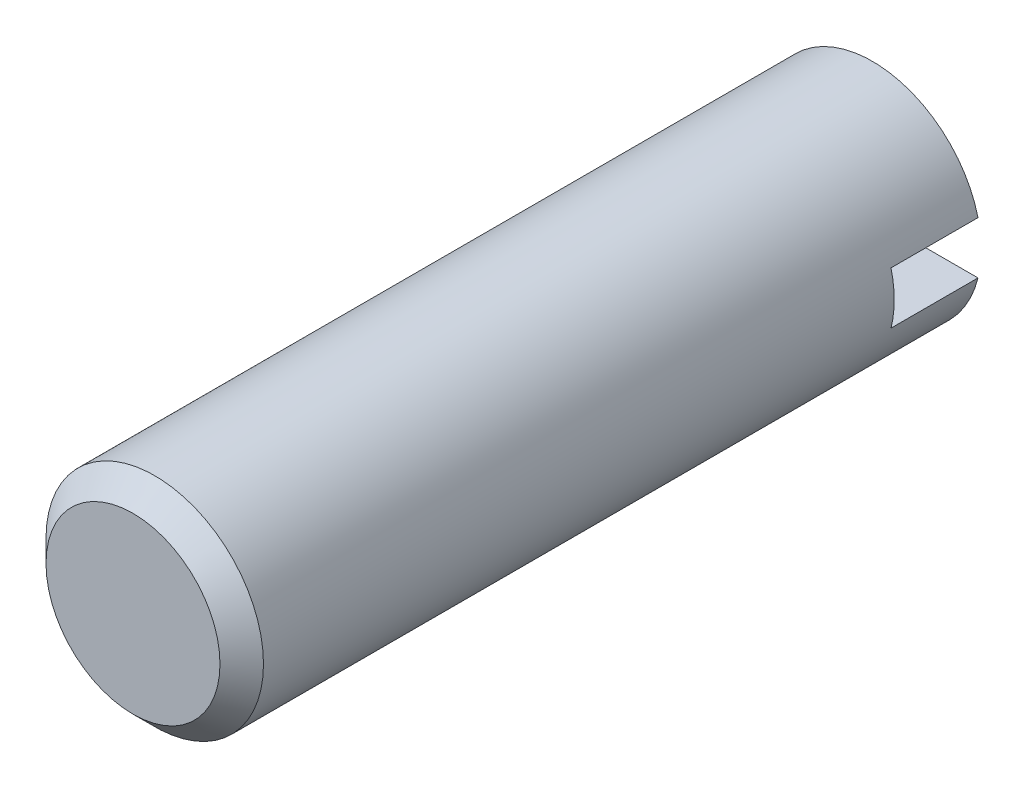
ISO-10303-21;
HEADER;
FILE_DESCRIPTION(('STEP AP214'),'2;1');
FILE_NAME('part.step','',(''),(''),'','','');
FILE_SCHEMA(('AUTOMOTIVE_DESIGN { 1 0 10303 214 1 1 1 1 }'));
ENDSEC;
DATA;
#1=APPLICATION_CONTEXT('core data for automotive mechanical design processes');
#2=APPLICATION_PROTOCOL_DEFINITION('international standard','automotive_design',2000,#1);
#3=PRODUCT_CONTEXT('',#1,'mechanical');
#4=PRODUCT('Part','Part','',(#3));
#5=PRODUCT_RELATED_PRODUCT_CATEGORY('part','',(#4));
#6=PRODUCT_DEFINITION_FORMATION('','',#4);
#7=PRODUCT_DEFINITION_CONTEXT('part definition',#1,'design');
#8=PRODUCT_DEFINITION('design','',#6,#7);
#9=PRODUCT_DEFINITION_SHAPE('','',#8);
#10=(LENGTH_UNIT() NAMED_UNIT(*) SI_UNIT(.MILLI.,.METRE.));
#11=(NAMED_UNIT(*) PLANE_ANGLE_UNIT() SI_UNIT($,.RADIAN.));
#12=(NAMED_UNIT(*) SI_UNIT($,.STERADIAN.) SOLID_ANGLE_UNIT());
#13=UNCERTAINTY_MEASURE_WITH_UNIT(LENGTH_MEASURE(1.E-05),#10,'distance_accuracy_value','');
#14=(GEOMETRIC_REPRESENTATION_CONTEXT(3) GLOBAL_UNCERTAINTY_ASSIGNED_CONTEXT((#13)) GLOBAL_UNIT_ASSIGNED_CONTEXT((#10,
#11,#12)) REPRESENTATION_CONTEXT('',''));
#15=CARTESIAN_POINT('',(0.,0.,0.));
#16=DIRECTION('',(0.,0.,1.));
#17=DIRECTION('',(1.,0.,0.));
#18=AXIS2_PLACEMENT_3D('',#15,#16,#17);
#19=CARTESIAN_POINT('',(0.,2.5,-17.));
#20=DIRECTION('',(0.,0.,1.));
#21=DIRECTION('',(1.,0.,0.));
#22=AXIS2_PLACEMENT_3D('',#19,#20,#21);
#23=PLANE('',#22);
#24=CARTESIAN_POINT('',(0.,0.,-17.));
#25=DIRECTION('',(0.,0.,1.));
#26=DIRECTION('',(1.,0.,0.));
#27=AXIS2_PLACEMENT_3D('',#24,#25,#26);
#28=CIRCLE('',#27,2.5);
#29=CARTESIAN_POINT('',(2.42693221990237,0.600000000000003,-17.));
#30=VERTEX_POINT('',#29);
#31=CARTESIAN_POINT('',(-2.42693221990226,0.600000000000059,-17.));
#32=VERTEX_POINT('',#31);
#33=EDGE_CURVE('E103',#30,#32,#28,.T.);
#34=ORIENTED_EDGE('',*,*,#33,.F.);
#35=DIRECTION('',(-1.,0.,0.));
#36=VECTOR('',#35,1.);
#37=CARTESIAN_POINT('',(1.11022302462516E-13,0.600000000000031,-17.));
#38=LINE('',#37,#36);
#39=EDGE_CURVE('E90',#30,#32,#38,.T.);
#40=ORIENTED_EDGE('',*,*,#39,.T.);
#41=EDGE_LOOP('',(#34,#40));
#42=FACE_BOUND('',#41,.T.);
#43=ADVANCED_FACE('F43',(#42),#23,.F.);
#44=CARTESIAN_POINT('',(0.,0.,0.));
#45=DIRECTION('',(0.,0.,-1.));
#46=DIRECTION('',(-1.,0.,0.));
#47=AXIS2_PLACEMENT_3D('',#44,#45,#46);
#48=PLANE('',#47);
#49=CARTESIAN_POINT('',(0.,0.,0.));
#50=DIRECTION('',(0.,0.,1.));
#51=DIRECTION('',(1.,0.,0.));
#52=AXIS2_PLACEMENT_3D('',#49,#50,#51);
#53=CIRCLE('',#52,2.);
#54=CARTESIAN_POINT('',(2.,0.,0.));
#55=VERTEX_POINT('',#54);
#56=EDGE_CURVE('E91',#55,#55,#53,.T.);
#57=ORIENTED_EDGE('',*,*,#56,.T.);
#58=EDGE_LOOP('',(#57));
#59=FACE_BOUND('',#58,.T.);
#60=ADVANCED_FACE('F45',(#59),#48,.F.);
#61=CARTESIAN_POINT('',(0.,0.,-0.5));
#62=DIRECTION('',(0.,0.,-1.));
#63=DIRECTION('',(-1.,0.,0.));
#64=AXIS2_PLACEMENT_3D('',#61,#62,#63);
#65=CONICAL_SURFACE('',#64,2.5,0.78539816339745);
#66=ORIENTED_EDGE('',*,*,#56,.F.);
#67=EDGE_LOOP('',(#66));
#68=FACE_BOUND('',#67,.T.);
#69=CARTESIAN_POINT('',(0.,0.,-0.5));
#70=DIRECTION('',(0.,0.,1.));
#71=DIRECTION('',(1.,0.,0.));
#72=AXIS2_PLACEMENT_3D('',#69,#70,#71);
#73=CIRCLE('',#72,2.5);
#74=CARTESIAN_POINT('',(2.50000000000001,0.,-0.5));
#75=VERTEX_POINT('',#74);
#76=EDGE_CURVE('E107',#75,#75,#73,.T.);
#77=ORIENTED_EDGE('',*,*,#76,.T.);
#78=EDGE_LOOP('',(#77));
#79=FACE_BOUND('',#78,.T.);
#80=ADVANCED_FACE('F129',(#68,#79),#65,.T.);
#81=CARTESIAN_POINT('',(0.,0.,0.));
#82=DIRECTION('',(0.,0.,1.));
#83=DIRECTION('',(1.,0.,0.));
#84=AXIS2_PLACEMENT_3D('',#81,#82,#83);
#85=CYLINDRICAL_SURFACE('',#84,2.5);
#86=CARTESIAN_POINT('',(0.,0.,-15.));
#87=DIRECTION('',(0.,0.,-1.));
#88=DIRECTION('',(-1.,0.,0.));
#89=AXIS2_PLACEMENT_3D('',#86,#87,#88);
#90=CIRCLE('',#89,2.5);
#91=CARTESIAN_POINT('',(2.42693221990237,0.600000000000003,-15.));
#92=VERTEX_POINT('',#91);
#93=CARTESIAN_POINT('',(2.42693221990239,-0.600000000000003,-15.));
#94=VERTEX_POINT('',#93);
#95=EDGE_CURVE('E11',#92,#94,#90,.T.);
#96=ORIENTED_EDGE('',*,*,#95,.F.);
#97=DIRECTION('',(0.,0.,1.));
#98=VECTOR('',#97,1.);
#99=CARTESIAN_POINT('',(2.42693221990237,0.600000000000003,0.));
#100=LINE('',#99,#98);
#101=EDGE_CURVE('E66',#92,#30,#100,.F.);
#102=ORIENTED_EDGE('',*,*,#101,.T.);
#103=ORIENTED_EDGE('',*,*,#33,.T.);
#104=DIRECTION('',(0.,0.,1.));
#105=VECTOR('',#104,1.);
#106=CARTESIAN_POINT('',(-2.42693221990226,0.600000000000059,0.));
#107=LINE('',#106,#105);
#108=CARTESIAN_POINT('',(-2.42693221990226,0.600000000000059,-15.));
#109=VERTEX_POINT('',#108);
#110=EDGE_CURVE('E104',#32,#109,#107,.T.);
#111=ORIENTED_EDGE('',*,*,#110,.T.);
#112=CARTESIAN_POINT('',(-2.42693221990228,-0.599999999999989,-15.));
#113=VERTEX_POINT('',#112);
#114=EDGE_CURVE('E47',#113,#109,#90,.T.);
#115=ORIENTED_EDGE('',*,*,#114,.F.);
#116=DIRECTION('',(0.,0.,1.));
#117=VECTOR('',#116,1.);
#118=CARTESIAN_POINT('',(-2.42693221990228,-0.599999999999989,0.));
#119=LINE('',#118,#117);
#120=CARTESIAN_POINT('',(-2.42693221990228,-0.599999999999989,-17.));
#121=VERTEX_POINT('',#120);
#122=EDGE_CURVE('E85',#113,#121,#119,.F.);
#123=ORIENTED_EDGE('',*,*,#122,.T.);
#124=CARTESIAN_POINT('',(2.42693221990239,-0.600000000000003,-17.));
#125=VERTEX_POINT('',#124);
#126=EDGE_CURVE('E98',#121,#125,#28,.T.);
#127=ORIENTED_EDGE('',*,*,#126,.T.);
#128=DIRECTION('',(0.,0.,1.));
#129=VECTOR('',#128,1.);
#130=CARTESIAN_POINT('',(2.42693221990239,-0.600000000000003,0.));
#131=LINE('',#130,#129);
#132=EDGE_CURVE('E58',#125,#94,#131,.T.);
#133=ORIENTED_EDGE('',*,*,#132,.T.);
#134=EDGE_LOOP('',(#96,#102,#103,#111,#115,#123,#127,#133));
#135=FACE_BOUND('',#134,.T.);
#136=ORIENTED_EDGE('',*,*,#76,.F.);
#137=EDGE_LOOP('',(#136));
#138=FACE_BOUND('',#137,.T.);
#139=ADVANCED_FACE('F96',(#135,#138),#85,.T.);
#140=ORIENTED_EDGE('',*,*,#126,.F.);
#141=DIRECTION('',(1.,0.,0.));
#142=VECTOR('',#141,1.);
#143=CARTESIAN_POINT('',(0.,-0.599999999999989,-17.));
#144=LINE('',#143,#142);
#145=EDGE_CURVE('E82',#121,#125,#144,.T.);
#146=ORIENTED_EDGE('',*,*,#145,.T.);
#147=EDGE_LOOP('',(#140,#146));
#148=FACE_BOUND('',#147,.T.);
#149=ADVANCED_FACE('F102',(#148),#23,.F.);
#150=CARTESIAN_POINT('',(2.71240317337387,-0.600000000000003,-15.));
#151=DIRECTION('',(0.,0.,-1.));
#152=DIRECTION('',(-1.,0.,0.));
#153=AXIS2_PLACEMENT_3D('',#150,#151,#152);
#154=PLANE('',#153);
#155=ORIENTED_EDGE('',*,*,#95,.T.);
#156=DIRECTION('',(-1.,0.,0.));
#157=VECTOR('',#156,1.);
#158=CARTESIAN_POINT('',(2.71240317337387,-0.600000000000003,-15.));
#159=LINE('',#158,#157);
#160=EDGE_CURVE('E119',#94,#113,#159,.T.);
#161=ORIENTED_EDGE('',*,*,#160,.T.);
#162=ORIENTED_EDGE('',*,*,#114,.T.);
#163=DIRECTION('',(1.,0.,0.));
#164=VECTOR('',#163,1.);
#165=CARTESIAN_POINT('',(2.71240317337387,0.600000000000017,-15.));
#166=LINE('',#165,#164);
#167=EDGE_CURVE('E100',#109,#92,#166,.T.);
#168=ORIENTED_EDGE('',*,*,#167,.T.);
#169=EDGE_LOOP('',(#155,#161,#162,#168));
#170=FACE_BOUND('',#169,.T.);
#171=ADVANCED_FACE('F118',(#170),#154,.T.);
#172=CARTESIAN_POINT('',(2.71240317337387,0.600000000000017,-15.));
#173=DIRECTION('',(0.,1.,0.));
#174=DIRECTION('',(0.,0.,1.));
#175=AXIS2_PLACEMENT_3D('',#172,#173,#174);
#176=PLANE('',#175);
#177=ORIENTED_EDGE('',*,*,#39,.F.);
#178=ORIENTED_EDGE('',*,*,#101,.F.);
#179=ORIENTED_EDGE('',*,*,#167,.F.);
#180=ORIENTED_EDGE('',*,*,#110,.F.);
#181=EDGE_LOOP('',(#177,#178,#179,#180));
#182=FACE_BOUND('',#181,.T.);
#183=ADVANCED_FACE('F120',(#182),#176,.F.);
#184=CARTESIAN_POINT('',(2.71240317337387,-0.600000000000003,-15.));
#185=DIRECTION('',(0.,-1.,0.));
#186=DIRECTION('',(0.,0.,-1.));
#187=AXIS2_PLACEMENT_3D('',#184,#185,#186);
#188=PLANE('',#187);
#189=ORIENTED_EDGE('',*,*,#145,.F.);
#190=ORIENTED_EDGE('',*,*,#122,.F.);
#191=ORIENTED_EDGE('',*,*,#160,.F.);
#192=ORIENTED_EDGE('',*,*,#132,.F.);
#193=EDGE_LOOP('',(#189,#190,#191,#192));
#194=FACE_BOUND('',#193,.T.);
#195=ADVANCED_FACE('F84',(#194),#188,.F.);
#196=CLOSED_SHELL('',(#43,#60,#80,#139,#149,#171,#183,#195));
#197=MANIFOLD_SOLID_BREP('B2',#196);
#198=ADVANCED_BREP_SHAPE_REPRESENTATION('',(#18,#197),#14);
#199=SHAPE_DEFINITION_REPRESENTATION(#9,#198);
ENDSEC;
END-ISO-10303-21;
